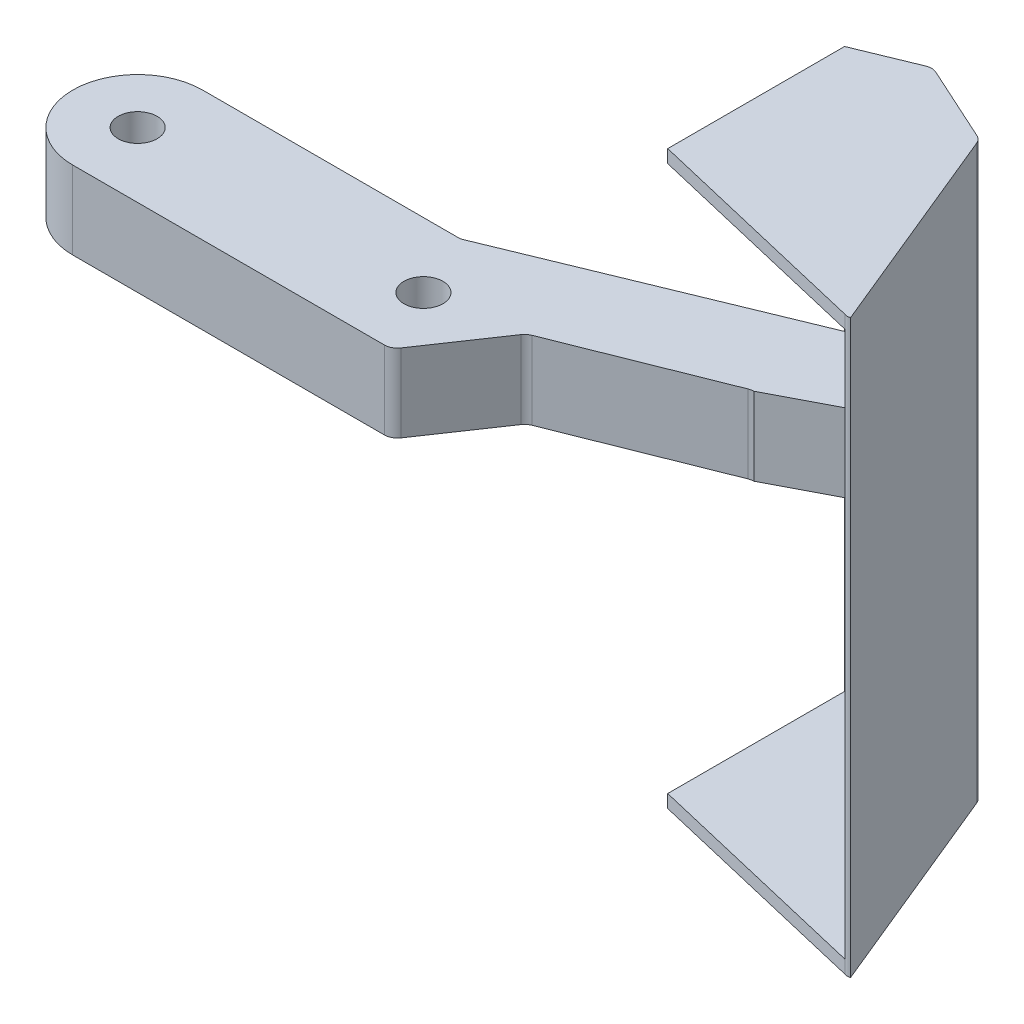
ISO-10303-21;
HEADER;
FILE_DESCRIPTION(('STEP AP214'),'2;1');
FILE_NAME('part.step','',(''),(''),'','','');
FILE_SCHEMA(('AUTOMOTIVE_DESIGN { 1 0 10303 214 1 1 1 1 }'));
ENDSEC;
DATA;
#1=APPLICATION_CONTEXT('core data for automotive mechanical design processes');
#2=APPLICATION_PROTOCOL_DEFINITION('international standard','automotive_design',2000,#1);
#3=PRODUCT_CONTEXT('',#1,'mechanical');
#4=PRODUCT('Part','Part','',(#3));
#5=PRODUCT_RELATED_PRODUCT_CATEGORY('part','',(#4));
#6=PRODUCT_DEFINITION_FORMATION('','',#4);
#7=PRODUCT_DEFINITION_CONTEXT('part definition',#1,'design');
#8=PRODUCT_DEFINITION('design','',#6,#7);
#9=PRODUCT_DEFINITION_SHAPE('','',#8);
#10=(LENGTH_UNIT() NAMED_UNIT(*) SI_UNIT(.MILLI.,.METRE.));
#11=(NAMED_UNIT(*) PLANE_ANGLE_UNIT() SI_UNIT($,.RADIAN.));
#12=(NAMED_UNIT(*) SI_UNIT($,.STERADIAN.) SOLID_ANGLE_UNIT());
#13=UNCERTAINTY_MEASURE_WITH_UNIT(LENGTH_MEASURE(1.E-05),#10,'distance_accuracy_value','');
#14=(GEOMETRIC_REPRESENTATION_CONTEXT(3) GLOBAL_UNCERTAINTY_ASSIGNED_CONTEXT((#13)) GLOBAL_UNIT_ASSIGNED_CONTEXT((#10,
#11,#12)) REPRESENTATION_CONTEXT('',''));
#15=CARTESIAN_POINT('',(0.,0.,0.));
#16=DIRECTION('',(0.,0.,1.));
#17=DIRECTION('',(1.,0.,0.));
#18=AXIS2_PLACEMENT_3D('',#15,#16,#17);
#19=CARTESIAN_POINT('',(29.3927079970185,6.,-0.393076672311641));
#20=DIRECTION('',(0.,-1.,0.));
#21=DIRECTION('',(0.,0.,-1.));
#22=AXIS2_PLACEMENT_3D('',#19,#20,#21);
#23=PLANE('',#22);
#24=CARTESIAN_POINT('',(22.,6.,0.));
#25=DIRECTION('',(0.,1.,0.));
#26=DIRECTION('',(0.,0.,1.));
#27=AXIS2_PLACEMENT_3D('',#24,#25,#26);
#28=CIRCLE('',#27,1.5);
#29=CARTESIAN_POINT('',(22.,6.,1.5));
#30=VERTEX_POINT('',#29);
#31=EDGE_CURVE('E363',#30,#30,#28,.T.);
#32=ORIENTED_EDGE('',*,*,#31,.F.);
#33=EDGE_LOOP('',(#32));
#34=FACE_BOUND('',#33,.T.);
#35=CARTESIAN_POINT('',(0.,6.,0.));
#36=DIRECTION('',(0.,1.,0.));
#37=DIRECTION('',(0.,0.,1.));
#38=AXIS2_PLACEMENT_3D('',#35,#36,#37);
#39=CIRCLE('',#38,1.5);
#40=CARTESIAN_POINT('',(0.,6.,1.5));
#41=VERTEX_POINT('',#40);
#42=EDGE_CURVE('E371',#41,#41,#39,.T.);
#43=ORIENTED_EDGE('',*,*,#42,.F.);
#44=EDGE_LOOP('',(#43));
#45=FACE_BOUND('',#44,.T.);
#46=CARTESIAN_POINT('',(41.2999485405069,6.,-5.14117513021263));
#47=DIRECTION('',(0.,-1.,0.));
#48=DIRECTION('',(0.,0.,-1.));
#49=AXIS2_PLACEMENT_3D('',#46,#47,#48);
#50=CIRCLE('',#49,1.);
#51=CARTESIAN_POINT('',(40.9295532164884,6.,-6.07004934341117));
#52=VERTEX_POINT('',#51);
#53=CARTESIAN_POINT('',(41.3044863809881,6.,-6.14116483416151));
#54=VERTEX_POINT('',#53);
#55=EDGE_CURVE('E387',#52,#54,#50,.T.);
#56=ORIENTED_EDGE('',*,*,#55,.T.);
#57=DIRECTION('',(0.886807807341087,0.,-0.462138413074366));
#58=VECTOR('',#57,1.);
#59=CARTESIAN_POINT('',(29.5810020879882,6.,-0.0317549011190851));
#60=LINE('',#59,#58);
#61=CARTESIAN_POINT('',(50.2217081147766,6.,-10.7881589934047));
#62=VERTEX_POINT('',#61);
#63=EDGE_CURVE('E285',#54,#62,#60,.T.);
#64=ORIENTED_EDGE('',*,*,#63,.T.);
#65=DIRECTION('',(0.957727854261941,0.,0.28767578481829));
#66=VECTOR('',#65,1.);
#67=CARTESIAN_POINT('',(33.9804632704377,6.,-15.66659375567));
#68=LINE('',#67,#66);
#69=CARTESIAN_POINT('',(40.8064668151839,6.,-13.6162451956183));
#70=VERTEX_POINT('',#69);
#71=EDGE_CURVE('E358',#70,#62,#68,.T.);
#72=ORIENTED_EDGE('',*,*,#71,.F.);
#73=DIRECTION('',(-0.924878228166549,0.,0.380263412733207));
#74=VECTOR('',#73,1.);
#75=CARTESIAN_POINT('',(20.0327114807882,6.,-5.07512177183345));
#76=LINE('',#75,#74);
#77=CARTESIAN_POINT('',(20.0327114807882,6.,-5.07512177183345));
#78=VERTEX_POINT('',#77);
#79=EDGE_CURVE('E391',#70,#78,#76,.T.);
#80=ORIENTED_EDGE('',*,*,#79,.T.);
#81=CARTESIAN_POINT('',(19.652448068055,6.,-6.));
#82=DIRECTION('',(0.,-1.,0.));
#83=DIRECTION('',(0.,0.,1.));
#84=AXIS2_PLACEMENT_3D('',#81,#82,#83);
#85=CIRCLE('',#84,1.);
#86=CARTESIAN_POINT('',(19.652448068055,6.,-5.));
#87=VERTEX_POINT('',#86);
#88=EDGE_CURVE('E394',#78,#87,#85,.T.);
#89=ORIENTED_EDGE('',*,*,#88,.T.);
#90=DIRECTION('',(-1.,0.,0.));
#91=VECTOR('',#90,1.);
#92=CARTESIAN_POINT('',(0.,6.,-5.));
#93=LINE('',#92,#91);
#94=CARTESIAN_POINT('',(0.,6.,-5.));
#95=VERTEX_POINT('',#94);
#96=EDGE_CURVE('E397',#87,#95,#93,.T.);
#97=ORIENTED_EDGE('',*,*,#96,.T.);
#98=CARTESIAN_POINT('',(0.,6.,0.));
#99=DIRECTION('',(0.,1.,0.));
#100=DIRECTION('',(0.,0.,1.));
#101=AXIS2_PLACEMENT_3D('',#98,#99,#100);
#102=CIRCLE('',#101,5.);
#103=CARTESIAN_POINT('',(0.,6.,5.));
#104=VERTEX_POINT('',#103);
#105=EDGE_CURVE('E400',#95,#104,#102,.T.);
#106=ORIENTED_EDGE('',*,*,#105,.T.);
#107=DIRECTION('',(1.,0.,0.));
#108=VECTOR('',#107,1.);
#109=CARTESIAN_POINT('',(0.,6.,5.));
#110=LINE('',#109,#108);
#111=CARTESIAN_POINT('',(23.9988758721515,6.,5.));
#112=VERTEX_POINT('',#111);
#113=EDGE_CURVE('E403',#104,#112,#110,.T.);
#114=ORIENTED_EDGE('',*,*,#113,.T.);
#115=CARTESIAN_POINT('',(23.9988758721515,6.,4.));
#116=DIRECTION('',(0.,1.,0.));
#117=DIRECTION('',(0.,0.,1.));
#118=AXIS2_PLACEMENT_3D('',#115,#116,#117);
#119=CIRCLE('',#118,1.);
#120=CARTESIAN_POINT('',(24.8266425433876,6.,4.56107248906957));
#121=VERTEX_POINT('',#120);
#122=EDGE_CURVE('E406',#112,#121,#119,.T.);
#123=ORIENTED_EDGE('',*,*,#122,.T.);
#124=DIRECTION('',(0.561072489069578,0.,-0.827766671236085));
#125=VECTOR('',#124,1.);
#126=CARTESIAN_POINT('',(24.8266425433876,6.,4.56107248906957));
#127=LINE('',#126,#125);
#128=CARTESIAN_POINT('',(28.5649413257824,6.,-0.954149161381216));
#129=VERTEX_POINT('',#128);
#130=EDGE_CURVE('E409',#121,#129,#127,.T.);
#131=ORIENTED_EDGE('',*,*,#130,.T.);
#132=CARTESIAN_POINT('',(29.3927079970185,6.,-0.393076672311641));
#133=DIRECTION('',(0.,-1.,0.));
#134=DIRECTION('',(0.,0.,-1.));
#135=AXIS2_PLACEMENT_3D('',#132,#133,#134);
#136=CIRCLE('',#135,1.);
#137=CARTESIAN_POINT('',(29.022312673,6.,-1.32195088551018));
#138=VERTEX_POINT('',#137);
#139=EDGE_CURVE('E379',#129,#138,#136,.T.);
#140=ORIENTED_EDGE('',*,*,#139,.T.);
#141=DIRECTION('',(0.92887421319854,0.,-0.370395324018532));
#142=VECTOR('',#141,1.);
#143=CARTESIAN_POINT('',(29.022312673,6.,-1.32195088551018));
#144=LINE('',#143,#142);
#145=EDGE_CURVE('E383',#138,#52,#144,.T.);
#146=ORIENTED_EDGE('',*,*,#145,.T.);
#147=EDGE_LOOP('',(#56,#64,#72,#80,#89,#97,#106,#114,#123,#131,#140,#146));
#148=FACE_BOUND('',#147,.T.);
#149=ADVANCED_FACE('F47',(#34,#45,#148),#23,.F.);
#150=CARTESIAN_POINT('',(29.3927079970185,0.,-0.393076672311641));
#151=DIRECTION('',(0.,-1.,0.));
#152=DIRECTION('',(0.,0.,-1.));
#153=AXIS2_PLACEMENT_3D('',#150,#151,#152);
#154=PLANE('',#153);
#155=DIRECTION('',(0.886807807341087,0.,-0.462138413074366));
#156=VECTOR('',#155,1.);
#157=CARTESIAN_POINT('',(41.3044863809881,0.,-6.14116483416151));
#158=LINE('',#157,#156);
#159=CARTESIAN_POINT('',(41.3044863809881,0.,-6.14116483416151));
#160=VERTEX_POINT('',#159);
#161=CARTESIAN_POINT('',(50.2217081147766,0.,-10.7881589934047));
#162=VERTEX_POINT('',#161);
#163=EDGE_CURVE('E276',#160,#162,#158,.T.);
#164=ORIENTED_EDGE('',*,*,#163,.F.);
#165=CARTESIAN_POINT('',(41.2999485405069,0.,-5.14117513021263));
#166=DIRECTION('',(0.,-1.,0.));
#167=DIRECTION('',(0.,0.,-1.));
#168=AXIS2_PLACEMENT_3D('',#165,#166,#167);
#169=CIRCLE('',#168,1.);
#170=CARTESIAN_POINT('',(40.9295532164884,0.,-6.07004934341117));
#171=VERTEX_POINT('',#170);
#172=EDGE_CURVE('E419',#171,#160,#169,.T.);
#173=ORIENTED_EDGE('',*,*,#172,.F.);
#174=DIRECTION('',(0.92887421319854,0.,-0.370395324018532));
#175=VECTOR('',#174,1.);
#176=CARTESIAN_POINT('',(29.022312673,0.,-1.32195088551018));
#177=LINE('',#176,#175);
#178=CARTESIAN_POINT('',(29.022312673,0.,-1.32195088551018));
#179=VERTEX_POINT('',#178);
#180=EDGE_CURVE('E416',#179,#171,#177,.T.);
#181=ORIENTED_EDGE('',*,*,#180,.F.);
#182=CARTESIAN_POINT('',(29.3927079970185,0.,-0.393076672311641));
#183=DIRECTION('',(0.,-1.,0.));
#184=DIRECTION('',(0.,0.,-1.));
#185=AXIS2_PLACEMENT_3D('',#182,#183,#184);
#186=CIRCLE('',#185,1.);
#187=CARTESIAN_POINT('',(28.5649413257824,0.,-0.954149161381216));
#188=VERTEX_POINT('',#187);
#189=EDGE_CURVE('E375',#188,#179,#186,.T.);
#190=ORIENTED_EDGE('',*,*,#189,.F.);
#191=DIRECTION('',(0.561072489069578,0.,-0.827766671236085));
#192=VECTOR('',#191,1.);
#193=CARTESIAN_POINT('',(24.8266425433876,0.,4.56107248906957));
#194=LINE('',#193,#192);
#195=CARTESIAN_POINT('',(24.8266425433876,0.,4.56107248906957));
#196=VERTEX_POINT('',#195);
#197=EDGE_CURVE('E384',#196,#188,#194,.T.);
#198=ORIENTED_EDGE('',*,*,#197,.F.);
#199=CARTESIAN_POINT('',(23.9988758721515,0.,4.));
#200=DIRECTION('',(0.,1.,0.));
#201=DIRECTION('',(0.,0.,1.));
#202=AXIS2_PLACEMENT_3D('',#199,#200,#201);
#203=CIRCLE('',#202,1.);
#204=CARTESIAN_POINT('',(23.9988758721515,0.,5.));
#205=VERTEX_POINT('',#204);
#206=EDGE_CURVE('E438',#205,#196,#203,.T.);
#207=ORIENTED_EDGE('',*,*,#206,.F.);
#208=DIRECTION('',(1.,0.,0.));
#209=VECTOR('',#208,1.);
#210=CARTESIAN_POINT('',(0.,0.,5.));
#211=LINE('',#210,#209);
#212=CARTESIAN_POINT('',(0.,0.,5.));
#213=VERTEX_POINT('',#212);
#214=EDGE_CURVE('E435',#213,#205,#211,.T.);
#215=ORIENTED_EDGE('',*,*,#214,.F.);
#216=CARTESIAN_POINT('',(0.,0.,0.));
#217=DIRECTION('',(0.,1.,0.));
#218=DIRECTION('',(0.,0.,1.));
#219=AXIS2_PLACEMENT_3D('',#216,#217,#218);
#220=CIRCLE('',#219,5.);
#221=CARTESIAN_POINT('',(0.,0.,-5.));
#222=VERTEX_POINT('',#221);
#223=EDGE_CURVE('E432',#222,#213,#220,.T.);
#224=ORIENTED_EDGE('',*,*,#223,.F.);
#225=DIRECTION('',(-1.,0.,0.));
#226=VECTOR('',#225,1.);
#227=CARTESIAN_POINT('',(0.,0.,-5.));
#228=LINE('',#227,#226);
#229=CARTESIAN_POINT('',(19.652448068055,0.,-5.));
#230=VERTEX_POINT('',#229);
#231=EDGE_CURVE('E429',#230,#222,#228,.T.);
#232=ORIENTED_EDGE('',*,*,#231,.F.);
#233=CARTESIAN_POINT('',(19.652448068055,0.,-6.));
#234=DIRECTION('',(0.,-1.,0.));
#235=DIRECTION('',(0.,0.,1.));
#236=AXIS2_PLACEMENT_3D('',#233,#234,#235);
#237=CIRCLE('',#236,1.);
#238=CARTESIAN_POINT('',(20.0327114807882,0.,-5.07512177183345));
#239=VERTEX_POINT('',#238);
#240=EDGE_CURVE('E426',#239,#230,#237,.T.);
#241=ORIENTED_EDGE('',*,*,#240,.F.);
#242=DIRECTION('',(-0.924878228166549,0.,0.380263412733207));
#243=VECTOR('',#242,1.);
#244=CARTESIAN_POINT('',(20.0327114807882,0.,-5.07512177183345));
#245=LINE('',#244,#243);
#246=CARTESIAN_POINT('',(40.8064668151839,0.,-13.6162451956183));
#247=VERTEX_POINT('',#246);
#248=EDGE_CURVE('E423',#247,#239,#245,.T.);
#249=ORIENTED_EDGE('',*,*,#248,.F.);
#250=DIRECTION('',(0.957727854261941,0.,0.28767578481829));
#251=VECTOR('',#250,1.);
#252=CARTESIAN_POINT('',(33.9804632704377,0.,-15.66659375567));
#253=LINE('',#252,#251);
#254=EDGE_CURVE('E354',#247,#162,#253,.T.);
#255=ORIENTED_EDGE('',*,*,#254,.T.);
#256=EDGE_LOOP('',(#164,#173,#181,#190,#198,#207,#215,#224,#232,#241,#249,#255));
#257=FACE_BOUND('',#256,.T.);
#258=CARTESIAN_POINT('',(0.,0.,0.));
#259=DIRECTION('',(0.,1.,0.));
#260=DIRECTION('',(0.,0.,1.));
#261=AXIS2_PLACEMENT_3D('',#258,#259,#260);
#262=CIRCLE('',#261,1.5);
#263=CARTESIAN_POINT('',(0.,0.,1.5));
#264=VERTEX_POINT('',#263);
#265=EDGE_CURVE('E367',#264,#264,#262,.T.);
#266=ORIENTED_EDGE('',*,*,#265,.T.);
#267=EDGE_LOOP('',(#266));
#268=FACE_BOUND('',#267,.T.);
#269=CARTESIAN_POINT('',(22.,0.,0.));
#270=DIRECTION('',(0.,1.,0.));
#271=DIRECTION('',(0.,0.,1.));
#272=AXIS2_PLACEMENT_3D('',#269,#270,#271);
#273=CIRCLE('',#272,1.5);
#274=CARTESIAN_POINT('',(22.,0.,1.5));
#275=VERTEX_POINT('',#274);
#276=EDGE_CURVE('E362',#275,#275,#273,.T.);
#277=ORIENTED_EDGE('',*,*,#276,.T.);
#278=EDGE_LOOP('',(#277));
#279=FACE_BOUND('',#278,.T.);
#280=ADVANCED_FACE('F492',(#257,#268,#279),#154,.T.);
#281=CARTESIAN_POINT('',(29.3927079970185,6.,-0.393076672311641));
#282=DIRECTION('',(0.,-1.,0.));
#283=DIRECTION('',(0.,0.,-1.));
#284=AXIS2_PLACEMENT_3D('',#281,#282,#283);
#285=CYLINDRICAL_SURFACE('',#284,1.);
#286=ORIENTED_EDGE('',*,*,#189,.T.);
#287=DIRECTION('',(0.,-1.,0.));
#288=VECTOR('',#287,1.);
#289=CARTESIAN_POINT('',(29.022312673,6.,-1.32195088551018));
#290=LINE('',#289,#288);
#291=EDGE_CURVE('E11',#138,#179,#290,.T.);
#292=ORIENTED_EDGE('',*,*,#291,.F.);
#293=ORIENTED_EDGE('',*,*,#139,.F.);
#294=DIRECTION('',(0.,-1.,0.));
#295=VECTOR('',#294,1.);
#296=CARTESIAN_POINT('',(28.5649413257824,6.,-0.954149161381216));
#297=LINE('',#296,#295);
#298=EDGE_CURVE('E412',#129,#188,#297,.T.);
#299=ORIENTED_EDGE('',*,*,#298,.T.);
#300=EDGE_LOOP('',(#286,#292,#293,#299));
#301=FACE_BOUND('',#300,.T.);
#302=ADVANCED_FACE('F49',(#301),#285,.F.);
#303=CARTESIAN_POINT('',(29.022312673,6.,-1.32195088551018));
#304=DIRECTION('',(-0.370395324018532,0.,-0.92887421319854));
#305=DIRECTION('',(-0.92887421319854,0.,0.370395324018532));
#306=AXIS2_PLACEMENT_3D('',#303,#304,#305);
#307=PLANE('',#306);
#308=ORIENTED_EDGE('',*,*,#180,.T.);
#309=DIRECTION('',(0.,-1.,0.));
#310=VECTOR('',#309,1.);
#311=CARTESIAN_POINT('',(40.9295532164884,6.,-6.07004934341117));
#312=LINE('',#311,#310);
#313=EDGE_CURVE('E56',#52,#171,#312,.T.);
#314=ORIENTED_EDGE('',*,*,#313,.F.);
#315=ORIENTED_EDGE('',*,*,#145,.F.);
#316=ORIENTED_EDGE('',*,*,#291,.T.);
#317=EDGE_LOOP('',(#308,#314,#315,#316));
#318=FACE_BOUND('',#317,.T.);
#319=ADVANCED_FACE('F527',(#318),#307,.F.);
#320=CARTESIAN_POINT('',(41.2999485405069,6.,-5.14117513021263));
#321=DIRECTION('',(0.,-1.,0.));
#322=DIRECTION('',(0.,0.,-1.));
#323=AXIS2_PLACEMENT_3D('',#320,#321,#322);
#324=CYLINDRICAL_SURFACE('',#323,1.);
#325=ORIENTED_EDGE('',*,*,#172,.T.);
#326=DIRECTION('',(0.,-1.,0.));
#327=VECTOR('',#326,1.);
#328=CARTESIAN_POINT('',(41.3044863809881,25.,-6.14116483416151));
#329=LINE('',#328,#327);
#330=EDGE_CURVE('E280',#54,#160,#329,.T.);
#331=ORIENTED_EDGE('',*,*,#330,.F.);
#332=ORIENTED_EDGE('',*,*,#55,.F.);
#333=ORIENTED_EDGE('',*,*,#313,.T.);
#334=EDGE_LOOP('',(#325,#331,#332,#333));
#335=FACE_BOUND('',#334,.T.);
#336=ADVANCED_FACE('F487',(#335),#324,.F.);
#337=CARTESIAN_POINT('',(52.341745918113,6.,-12.2448345027485));
#338=DIRECTION('',(-0.92487822816655,0.,0.380263412733204));
#339=DIRECTION('',(0.380263412733204,0.,0.92487822816655));
#340=AXIS2_PLACEMENT_3D('',#337,#338,#339);
#341=PLANE('',#340);
#342=DIRECTION('',(0.,-1.,0.));
#343=VECTOR('',#342,1.);
#344=CARTESIAN_POINT('',(52.341745918113,6.,-12.2448345027485));
#345=LINE('',#344,#343);
#346=CARTESIAN_POINT('',(52.341745918113,25.,-12.2448345027485));
#347=VERTEX_POINT('',#346);
#348=CARTESIAN_POINT('',(52.341745918113,-19.,-12.2448345027485));
#349=VERTEX_POINT('',#348);
#350=EDGE_CURVE('E479',#347,#349,#345,.T.);
#351=ORIENTED_EDGE('',*,*,#350,.F.);
#352=DIRECTION('',(0.380263412733212,0.,0.924878228166547));
#353=VECTOR('',#352,1.);
#354=CARTESIAN_POINT('',(49.0795915521628,25.,-20.1790596975939));
#355=LINE('',#354,#353);
#356=CARTESIAN_POINT('',(59.1147618685715,25.,4.22852260141965));
#357=VERTEX_POINT('',#356);
#358=EDGE_CURVE('E307',#347,#357,#355,.T.);
#359=ORIENTED_EDGE('',*,*,#358,.T.);
#360=DIRECTION('',(0.,1.,0.));
#361=VECTOR('',#360,1.);
#362=CARTESIAN_POINT('',(59.1147618685715,-19.,4.22852260141965));
#363=LINE('',#362,#361);
#364=CARTESIAN_POINT('',(59.1147618685715,-19.,4.22852260141965));
#365=VERTEX_POINT('',#364);
#366=EDGE_CURVE('E341',#365,#357,#363,.T.);
#367=ORIENTED_EDGE('',*,*,#366,.F.);
#368=DIRECTION('',(0.380263412733212,0.,0.924878228166547));
#369=VECTOR('',#368,1.);
#370=CARTESIAN_POINT('',(49.0795915521628,-19.,-20.1790596975939));
#371=LINE('',#370,#369);
#372=EDGE_CURVE('E330',#349,#365,#371,.T.);
#373=ORIENTED_EDGE('',*,*,#372,.F.);
#374=EDGE_LOOP('',(#351,#359,#367,#373));
#375=FACE_BOUND('',#374,.T.);
#376=ADVANCED_FACE('F576',(#375),#341,.F.);
#377=CARTESIAN_POINT('',(51.4168676899464,6.,-11.8645710900153));
#378=DIRECTION('',(0.,-1.,0.));
#379=DIRECTION('',(0.,0.,-1.));
#380=AXIS2_PLACEMENT_3D('',#377,#378,#379);
#381=CYLINDRICAL_SURFACE('',#380,1.);
#382=ORIENTED_EDGE('',*,*,#350,.T.);
#383=CARTESIAN_POINT('',(51.4168676899464,-19.,-11.8645710900153));
#384=DIRECTION('',(0.,-1.,0.));
#385=DIRECTION('',(0.,0.,-1.));
#386=AXIS2_PLACEMENT_3D('',#383,#384,#385);
#387=CIRCLE('',#386,1.);
#388=CARTESIAN_POINT('',(51.8314021080849,-19.,-12.7746047246566));
#389=VERTEX_POINT('',#388);
#390=EDGE_CURVE('E326',#389,#349,#387,.T.);
#391=ORIENTED_EDGE('',*,*,#390,.F.);
#392=DIRECTION('',(0.,-1.,0.));
#393=VECTOR('',#392,1.);
#394=CARTESIAN_POINT('',(51.8314021080849,6.,-12.7746047246566));
#395=LINE('',#394,#393);
#396=CARTESIAN_POINT('',(51.8314021080849,25.,-12.7746047246566));
#397=VERTEX_POINT('',#396);
#398=EDGE_CURVE('E476',#397,#389,#395,.T.);
#399=ORIENTED_EDGE('',*,*,#398,.F.);
#400=CARTESIAN_POINT('',(51.4168676899464,25.,-11.8645710900153));
#401=DIRECTION('',(0.,-1.,0.));
#402=DIRECTION('',(0.,0.,-1.));
#403=AXIS2_PLACEMENT_3D('',#400,#401,#402);
#404=CIRCLE('',#403,1.);
#405=EDGE_CURVE('E303',#397,#347,#404,.T.);
#406=ORIENTED_EDGE('',*,*,#405,.T.);
#407=EDGE_LOOP('',(#382,#391,#399,#406));
#408=FACE_BOUND('',#407,.T.);
#409=ADVANCED_FACE('F579',(#408),#381,.T.);
#410=CARTESIAN_POINT('',(46.0241839243038,6.,-15.4198825684427));
#411=DIRECTION('',(-0.414534418138482,0.,0.910033634641374));
#412=DIRECTION('',(0.910033634641374,0.,0.414534418138482));
#413=AXIS2_PLACEMENT_3D('',#410,#411,#412);
#414=PLANE('',#413);
#415=ORIENTED_EDGE('',*,*,#398,.T.);
#416=DIRECTION('',(0.910033634641374,0.,0.414534418138482));
#417=VECTOR('',#416,1.);
#418=CARTESIAN_POINT('',(13.7257403509048,-19.,-30.1323239594181));
#419=LINE('',#418,#417);
#420=CARTESIAN_POINT('',(46.0241839243038,-19.,-15.4198825684427));
#421=VERTEX_POINT('',#420);
#422=EDGE_CURVE('E322',#421,#389,#419,.T.);
#423=ORIENTED_EDGE('',*,*,#422,.F.);
#424=DIRECTION('',(0.,-1.,0.));
#425=VECTOR('',#424,1.);
#426=CARTESIAN_POINT('',(46.0241839243038,6.,-15.4198825684427));
#427=LINE('',#426,#425);
#428=CARTESIAN_POINT('',(46.0241839243038,25.,-15.4198825684427));
#429=VERTEX_POINT('',#428);
#430=EDGE_CURVE('E473',#429,#421,#427,.T.);
#431=ORIENTED_EDGE('',*,*,#430,.F.);
#432=DIRECTION('',(0.910033634641374,0.,0.414534418138482));
#433=VECTOR('',#432,1.);
#434=CARTESIAN_POINT('',(13.7257403509048,25.,-30.1323239594181));
#435=LINE('',#434,#433);
#436=EDGE_CURVE('E299',#429,#397,#435,.T.);
#437=ORIENTED_EDGE('',*,*,#436,.T.);
#438=EDGE_LOOP('',(#415,#423,#431,#437));
#439=FACE_BOUND('',#438,.T.);
#440=ADVANCED_FACE('F583',(#439),#414,.F.);
#441=CARTESIAN_POINT('',(45.6096495061653,6.,-14.5098489338013));
#442=DIRECTION('',(0.,-1.,0.));
#443=DIRECTION('',(0.,0.,-1.));
#444=AXIS2_PLACEMENT_3D('',#441,#442,#443);
#445=CYLINDRICAL_SURFACE('',#444,1.);
#446=ORIENTED_EDGE('',*,*,#430,.T.);
#447=CARTESIAN_POINT('',(45.6096495061653,-19.,-14.5098489338013));
#448=DIRECTION('',(0.,-1.,0.));
#449=DIRECTION('',(0.,0.,-1.));
#450=AXIS2_PLACEMENT_3D('',#447,#448,#449);
#451=CIRCLE('',#450,1.);
#452=CARTESIAN_POINT('',(45.2293860934321,-19.,-15.4347271619678));
#453=VERTEX_POINT('',#452);
#454=EDGE_CURVE('E318',#453,#421,#451,.T.);
#455=ORIENTED_EDGE('',*,*,#454,.F.);
#456=DIRECTION('',(0.,-1.,0.));
#457=VECTOR('',#456,1.);
#458=CARTESIAN_POINT('',(45.2293860934321,6.,-15.4347271619678));
#459=LINE('',#458,#457);
#460=CARTESIAN_POINT('',(45.2293860934321,25.,-15.4347271619678));
#461=VERTEX_POINT('',#460);
#462=EDGE_CURVE('E470',#461,#453,#459,.T.);
#463=ORIENTED_EDGE('',*,*,#462,.F.);
#464=CARTESIAN_POINT('',(45.6096495061653,25.,-14.5098489338013));
#465=DIRECTION('',(0.,-1.,0.));
#466=DIRECTION('',(0.,0.,-1.));
#467=AXIS2_PLACEMENT_3D('',#464,#465,#466);
#468=CIRCLE('',#467,1.);
#469=EDGE_CURVE('E295',#461,#429,#468,.T.);
#470=ORIENTED_EDGE('',*,*,#469,.T.);
#471=EDGE_LOOP('',(#446,#455,#463,#470));
#472=FACE_BOUND('',#471,.T.);
#473=ADVANCED_FACE('F586',(#472),#445,.T.);
#474=CARTESIAN_POINT('',(20.0327114807882,6.,-5.07512177183345));
#475=DIRECTION('',(0.380263412733207,0.,0.924878228166549));
#476=DIRECTION('',(0.924878228166549,0.,-0.380263412733207));
#477=AXIS2_PLACEMENT_3D('',#474,#475,#476);
#478=PLANE('',#477);
#479=ORIENTED_EDGE('',*,*,#462,.T.);
#480=DIRECTION('',(0.924878228166549,0.,-0.380263412733207));
#481=VECTOR('',#480,1.);
#482=CARTESIAN_POINT('',(1.11182846478431,-19.,2.7041937407118));
#483=LINE('',#482,#481);
#484=CARTESIAN_POINT('',(40.8064668151839,-19.,-13.6162451956183));
#485=VERTEX_POINT('',#484);
#486=EDGE_CURVE('E314',#485,#453,#483,.T.);
#487=ORIENTED_EDGE('',*,*,#486,.F.);
#488=DIRECTION('',(0.,1.,0.));
#489=VECTOR('',#488,1.);
#490=CARTESIAN_POINT('',(40.8064668151839,-19.,-13.6162451956183));
#491=LINE('',#490,#489);
#492=CARTESIAN_POINT('',(40.8064668151839,-18.,-13.6162451956183));
#493=VERTEX_POINT('',#492);
#494=EDGE_CURVE('E345',#485,#493,#491,.T.);
#495=ORIENTED_EDGE('',*,*,#494,.T.);
#496=EDGE_CURVE('E350',#493,#247,#491,.T.);
#497=ORIENTED_EDGE('',*,*,#496,.T.);
#498=ORIENTED_EDGE('',*,*,#248,.T.);
#499=DIRECTION('',(0.,-1.,0.));
#500=VECTOR('',#499,1.);
#501=CARTESIAN_POINT('',(20.0327114807882,6.,-5.07512177183345));
#502=LINE('',#501,#500);
#503=EDGE_CURVE('E466',#78,#239,#502,.T.);
#504=ORIENTED_EDGE('',*,*,#503,.F.);
#505=ORIENTED_EDGE('',*,*,#79,.F.);
#506=CARTESIAN_POINT('',(40.8064668151839,24.,-13.6162451956183));
#507=VERTEX_POINT('',#506);
#508=EDGE_CURVE('E344',#70,#507,#491,.T.);
#509=ORIENTED_EDGE('',*,*,#508,.T.);
#510=DIRECTION('',(0.,1.,0.));
#511=VECTOR('',#510,1.);
#512=CARTESIAN_POINT('',(40.8064668151839,24.,-13.6162451956183));
#513=LINE('',#512,#511);
#514=CARTESIAN_POINT('',(40.8064668151839,25.,-13.6162451956183));
#515=VERTEX_POINT('',#514);
#516=EDGE_CURVE('E224',#507,#515,#513,.T.);
#517=ORIENTED_EDGE('',*,*,#516,.T.);
#518=DIRECTION('',(0.924878228166549,0.,-0.380263412733207));
#519=VECTOR('',#518,1.);
#520=CARTESIAN_POINT('',(1.11182846478431,25.,2.7041937407118));
#521=LINE('',#520,#519);
#522=EDGE_CURVE('E291',#515,#461,#521,.T.);
#523=ORIENTED_EDGE('',*,*,#522,.T.);
#524=EDGE_LOOP('',(#479,#487,#495,#497,#498,#504,#505,#509,#517,#523));
#525=FACE_BOUND('',#524,.T.);
#526=ADVANCED_FACE('F518',(#525),#478,.F.);
#527=CARTESIAN_POINT('',(19.652448068055,6.,-6.));
#528=DIRECTION('',(0.,-1.,0.));
#529=DIRECTION('',(0.,0.,-1.));
#530=AXIS2_PLACEMENT_3D('',#527,#528,#529);
#531=CYLINDRICAL_SURFACE('',#530,1.);
#532=ORIENTED_EDGE('',*,*,#240,.T.);
#533=DIRECTION('',(0.,-1.,0.));
#534=VECTOR('',#533,1.);
#535=CARTESIAN_POINT('',(19.652448068055,6.,-5.));
#536=LINE('',#535,#534);
#537=EDGE_CURVE('E462',#87,#230,#536,.T.);
#538=ORIENTED_EDGE('',*,*,#537,.F.);
#539=ORIENTED_EDGE('',*,*,#88,.F.);
#540=ORIENTED_EDGE('',*,*,#503,.T.);
#541=EDGE_LOOP('',(#532,#538,#539,#540));
#542=FACE_BOUND('',#541,.T.);
#543=ADVANCED_FACE('F558',(#542),#531,.F.);
#544=CARTESIAN_POINT('',(0.,6.,-5.));
#545=DIRECTION('',(0.,0.,1.));
#546=DIRECTION('',(1.,0.,0.));
#547=AXIS2_PLACEMENT_3D('',#544,#545,#546);
#548=PLANE('',#547);
#549=ORIENTED_EDGE('',*,*,#231,.T.);
#550=DIRECTION('',(0.,-1.,0.));
#551=VECTOR('',#550,1.);
#552=CARTESIAN_POINT('',(0.,6.,-5.));
#553=LINE('',#552,#551);
#554=EDGE_CURVE('E458',#95,#222,#553,.T.);
#555=ORIENTED_EDGE('',*,*,#554,.F.);
#556=ORIENTED_EDGE('',*,*,#96,.F.);
#557=ORIENTED_EDGE('',*,*,#537,.T.);
#558=EDGE_LOOP('',(#549,#555,#556,#557));
#559=FACE_BOUND('',#558,.T.);
#560=ADVANCED_FACE('F554',(#559),#548,.F.);
#561=CARTESIAN_POINT('',(0.,6.,0.));
#562=DIRECTION('',(0.,-1.,0.));
#563=DIRECTION('',(0.,0.,-1.));
#564=AXIS2_PLACEMENT_3D('',#561,#562,#563);
#565=CYLINDRICAL_SURFACE('',#564,5.);
#566=ORIENTED_EDGE('',*,*,#223,.T.);
#567=DIRECTION('',(0.,-1.,0.));
#568=VECTOR('',#567,1.);
#569=CARTESIAN_POINT('',(0.,6.,5.));
#570=LINE('',#569,#568);
#571=EDGE_CURVE('E454',#104,#213,#570,.T.);
#572=ORIENTED_EDGE('',*,*,#571,.F.);
#573=ORIENTED_EDGE('',*,*,#105,.F.);
#574=ORIENTED_EDGE('',*,*,#554,.T.);
#575=EDGE_LOOP('',(#566,#572,#573,#574));
#576=FACE_BOUND('',#575,.T.);
#577=ADVANCED_FACE('F549',(#576),#565,.T.);
#578=CARTESIAN_POINT('',(0.,6.,5.));
#579=DIRECTION('',(0.,0.,-1.));
#580=DIRECTION('',(-1.,0.,0.));
#581=AXIS2_PLACEMENT_3D('',#578,#579,#580);
#582=PLANE('',#581);
#583=ORIENTED_EDGE('',*,*,#214,.T.);
#584=DIRECTION('',(0.,-1.,0.));
#585=VECTOR('',#584,1.);
#586=CARTESIAN_POINT('',(23.9988758721515,6.,5.));
#587=LINE('',#586,#585);
#588=EDGE_CURVE('E450',#112,#205,#587,.T.);
#589=ORIENTED_EDGE('',*,*,#588,.F.);
#590=ORIENTED_EDGE('',*,*,#113,.F.);
#591=ORIENTED_EDGE('',*,*,#571,.T.);
#592=EDGE_LOOP('',(#583,#589,#590,#591));
#593=FACE_BOUND('',#592,.T.);
#594=ADVANCED_FACE('F543',(#593),#582,.F.);
#595=CARTESIAN_POINT('',(23.9988758721515,6.,4.));
#596=DIRECTION('',(0.,-1.,0.));
#597=DIRECTION('',(0.,0.,-1.));
#598=AXIS2_PLACEMENT_3D('',#595,#596,#597);
#599=CYLINDRICAL_SURFACE('',#598,1.);
#600=ORIENTED_EDGE('',*,*,#206,.T.);
#601=DIRECTION('',(0.,-1.,0.));
#602=VECTOR('',#601,1.);
#603=CARTESIAN_POINT('',(24.8266425433876,6.,4.56107248906957));
#604=LINE('',#603,#602);
#605=EDGE_CURVE('E446',#121,#196,#604,.T.);
#606=ORIENTED_EDGE('',*,*,#605,.F.);
#607=ORIENTED_EDGE('',*,*,#122,.F.);
#608=ORIENTED_EDGE('',*,*,#588,.T.);
#609=EDGE_LOOP('',(#600,#606,#607,#608));
#610=FACE_BOUND('',#609,.T.);
#611=ADVANCED_FACE('F539',(#610),#599,.T.);
#612=CARTESIAN_POINT('',(24.8266425433876,6.,4.56107248906957));
#613=DIRECTION('',(-0.827766671236085,0.,-0.561072489069578));
#614=DIRECTION('',(-0.561072489069578,0.,0.827766671236085));
#615=AXIS2_PLACEMENT_3D('',#612,#613,#614);
#616=PLANE('',#615);
#617=ORIENTED_EDGE('',*,*,#197,.T.);
#618=ORIENTED_EDGE('',*,*,#298,.F.);
#619=ORIENTED_EDGE('',*,*,#130,.F.);
#620=ORIENTED_EDGE('',*,*,#605,.T.);
#621=EDGE_LOOP('',(#617,#618,#619,#620));
#622=FACE_BOUND('',#621,.T.);
#623=ADVANCED_FACE('F534',(#622),#616,.F.);
#624=CARTESIAN_POINT('',(0.,6.,0.));
#625=DIRECTION('',(0.,-1.,0.));
#626=DIRECTION('',(0.,0.,-1.));
#627=AXIS2_PLACEMENT_3D('',#624,#625,#626);
#628=CYLINDRICAL_SURFACE('',#627,1.5);
#629=ORIENTED_EDGE('',*,*,#42,.T.);
#630=EDGE_LOOP('',(#629));
#631=FACE_BOUND('',#630,.T.);
#632=ORIENTED_EDGE('',*,*,#265,.F.);
#633=EDGE_LOOP('',(#632));
#634=FACE_BOUND('',#633,.T.);
#635=ADVANCED_FACE('F605',(#631,#634),#628,.F.);
#636=CARTESIAN_POINT('',(22.,6.,0.));
#637=DIRECTION('',(0.,-1.,0.));
#638=DIRECTION('',(0.,0.,-1.));
#639=AXIS2_PLACEMENT_3D('',#636,#637,#638);
#640=CYLINDRICAL_SURFACE('',#639,1.5);
#641=ORIENTED_EDGE('',*,*,#31,.T.);
#642=EDGE_LOOP('',(#641));
#643=FACE_BOUND('',#642,.T.);
#644=ORIENTED_EDGE('',*,*,#276,.F.);
#645=EDGE_LOOP('',(#644));
#646=FACE_BOUND('',#645,.T.);
#647=ADVANCED_FACE('F658',(#643,#646),#640,.F.);
#648=CARTESIAN_POINT('',(42.6992067054328,-19.,-24.1104075616895));
#649=DIRECTION('',(0.870771777576706,0.,-0.491687412260985));
#650=DIRECTION('',(-0.491687412260985,0.,-0.870771777576706));
#651=AXIS2_PLACEMENT_3D('',#648,#649,#650);
#652=PLANE('',#651);
#653=DIRECTION('',(0.,1.,0.));
#654=VECTOR('',#653,1.);
#655=CARTESIAN_POINT('',(58.7009830571204,-19.,4.22852260141965));
#656=LINE('',#655,#654);
#657=CARTESIAN_POINT('',(58.7009830571204,-18.,4.22852260141965));
#658=VERTEX_POINT('',#657);
#659=CARTESIAN_POINT('',(58.7009830571204,24.,4.22852260141965));
#660=VERTEX_POINT('',#659);
#661=EDGE_CURVE('E337',#658,#660,#656,.T.);
#662=ORIENTED_EDGE('',*,*,#661,.T.);
#663=DIRECTION('',(-0.491687412260985,0.,-0.870771777576706));
#664=VECTOR('',#663,1.);
#665=CARTESIAN_POINT('',(50.2217081147766,24.,-10.7881589934047));
#666=LINE('',#665,#664);
#667=CARTESIAN_POINT('',(50.2217081147766,24.,-10.7881589934047));
#668=VERTEX_POINT('',#667);
#669=EDGE_CURVE('E63',#660,#668,#666,.T.);
#670=ORIENTED_EDGE('',*,*,#669,.T.);
#671=DIRECTION('',(0.,1.,0.));
#672=VECTOR('',#671,1.);
#673=CARTESIAN_POINT('',(50.2217081147766,-19.,-10.7881589934047));
#674=LINE('',#673,#672);
#675=EDGE_CURVE('E349',#62,#668,#674,.T.);
#676=ORIENTED_EDGE('',*,*,#675,.F.);
#677=DIRECTION('',(0.,-1.,0.));
#678=VECTOR('',#677,1.);
#679=CARTESIAN_POINT('',(50.2217081147766,25.,-10.7881589934047));
#680=LINE('',#679,#678);
#681=EDGE_CURVE('E281',#62,#162,#680,.T.);
#682=ORIENTED_EDGE('',*,*,#681,.T.);
#683=CARTESIAN_POINT('',(50.2217081147766,-18.,-10.7881589934047));
#684=VERTEX_POINT('',#683);
#685=EDGE_CURVE('E351',#684,#162,#674,.T.);
#686=ORIENTED_EDGE('',*,*,#685,.F.);
#687=DIRECTION('',(0.491687412260985,0.,0.870771777576706));
#688=VECTOR('',#687,1.);
#689=CARTESIAN_POINT('',(58.7009830571204,-18.,4.22852260141965));
#690=LINE('',#689,#688);
#691=EDGE_CURVE('E254',#684,#658,#690,.T.);
#692=ORIENTED_EDGE('',*,*,#691,.T.);
#693=EDGE_LOOP('',(#662,#670,#676,#682,#686,#692));
#694=FACE_BOUND('',#693,.T.);
#695=ADVANCED_FACE('F500',(#694),#652,.F.);
#696=CARTESIAN_POINT('',(7.12851667078863,-19.,-23.7321990083289));
#697=DIRECTION('',(0.28767578481829,0.,-0.957727854261941));
#698=DIRECTION('',(-0.957727854261941,0.,-0.28767578481829));
#699=AXIS2_PLACEMENT_3D('',#696,#697,#698);
#700=PLANE('',#699);
#701=ORIENTED_EDGE('',*,*,#675,.T.);
#702=DIRECTION('',(-0.957727854261941,0.,-0.287675784818289));
#703=VECTOR('',#702,1.);
#704=CARTESIAN_POINT('',(40.8064668151839,24.,-13.6162451956183));
#705=LINE('',#704,#703);
#706=EDGE_CURVE('E70',#668,#507,#705,.T.);
#707=ORIENTED_EDGE('',*,*,#706,.T.);
#708=ORIENTED_EDGE('',*,*,#508,.F.);
#709=ORIENTED_EDGE('',*,*,#71,.T.);
#710=EDGE_LOOP('',(#701,#707,#708,#709));
#711=FACE_BOUND('',#710,.T.);
#712=ADVANCED_FACE('F523',(#711),#700,.F.);
#713=ORIENTED_EDGE('',*,*,#496,.F.);
#714=DIRECTION('',(0.957727854261941,0.,0.287675784818289));
#715=VECTOR('',#714,1.);
#716=CARTESIAN_POINT('',(50.2217081147766,-18.,-10.7881589934047));
#717=LINE('',#716,#715);
#718=EDGE_CURVE('E250',#493,#684,#717,.T.);
#719=ORIENTED_EDGE('',*,*,#718,.T.);
#720=ORIENTED_EDGE('',*,*,#685,.T.);
#721=ORIENTED_EDGE('',*,*,#254,.F.);
#722=EDGE_LOOP('',(#713,#719,#720,#721));
#723=FACE_BOUND('',#722,.T.);
#724=ADVANCED_FACE('F561',(#723),#700,.F.);
#725=CARTESIAN_POINT('',(58.907872462846,-19.,3.72532534239716));
#726=DIRECTION('',(0.,1.,0.));
#727=DIRECTION('',(0.,0.,1.));
#728=AXIS2_PLACEMENT_3D('',#725,#726,#727);
#729=CYLINDRICAL_SURFACE('',#728,0.544068660822531);
#730=ORIENTED_EDGE('',*,*,#366,.T.);
#731=CARTESIAN_POINT('',(58.907872462846,25.,3.72532534239716));
#732=DIRECTION('',(0.,-1.,0.));
#733=DIRECTION('',(0.,0.,-1.));
#734=AXIS2_PLACEMENT_3D('',#731,#732,#733);
#735=CIRCLE('',#734,0.544068660822531);
#736=CARTESIAN_POINT('',(58.7009830571204,25.,4.22852260141965));
#737=VERTEX_POINT('',#736);
#738=EDGE_CURVE('E311',#357,#737,#735,.T.);
#739=ORIENTED_EDGE('',*,*,#738,.T.);
#740=DIRECTION('',(0.,1.,0.));
#741=VECTOR('',#740,1.);
#742=CARTESIAN_POINT('',(58.7009830571204,24.,4.22852260141965));
#743=LINE('',#742,#741);
#744=EDGE_CURVE('E236',#660,#737,#743,.T.);
#745=ORIENTED_EDGE('',*,*,#744,.F.);
#746=ORIENTED_EDGE('',*,*,#661,.F.);
#747=CARTESIAN_POINT('',(58.7009830571204,-19.,4.22852260141965));
#748=VERTEX_POINT('',#747);
#749=EDGE_CURVE('E338',#748,#658,#656,.T.);
#750=ORIENTED_EDGE('',*,*,#749,.F.);
#751=CARTESIAN_POINT('',(58.907872462846,-19.,3.72532534239716));
#752=DIRECTION('',(0.,-1.,0.));
#753=DIRECTION('',(0.,0.,-1.));
#754=AXIS2_PLACEMENT_3D('',#751,#752,#753);
#755=CIRCLE('',#754,0.544068660822531);
#756=EDGE_CURVE('E333',#365,#748,#755,.T.);
#757=ORIENTED_EDGE('',*,*,#756,.F.);
#758=EDGE_LOOP('',(#730,#739,#745,#746,#750,#757));
#759=FACE_BOUND('',#758,.T.);
#760=ADVANCED_FACE('F508',(#759),#729,.T.);
#761=CARTESIAN_POINT('',(0.,-19.,0.));
#762=DIRECTION('',(0.,-1.,0.));
#763=DIRECTION('',(0.,0.,-1.));
#764=AXIS2_PLACEMENT_3D('',#761,#762,#763);
#765=PLANE('',#764);
#766=DIRECTION('',(0.,0.,-1.));
#767=VECTOR('',#766,1.);
#768=CARTESIAN_POINT('',(40.8064668151839,-19.,-13.6162451956183));
#769=LINE('',#768,#767);
#770=CARTESIAN_POINT('',(40.8064668151839,-19.,0.));
#771=VERTEX_POINT('',#770);
#772=EDGE_CURVE('E255',#771,#485,#769,.T.);
#773=ORIENTED_EDGE('',*,*,#772,.T.);
#774=ORIENTED_EDGE('',*,*,#486,.T.);
#775=ORIENTED_EDGE('',*,*,#454,.T.);
#776=ORIENTED_EDGE('',*,*,#422,.T.);
#777=ORIENTED_EDGE('',*,*,#390,.T.);
#778=ORIENTED_EDGE('',*,*,#372,.T.);
#779=ORIENTED_EDGE('',*,*,#756,.T.);
#780=DIRECTION('',(-0.973197885396587,0.,-0.229969293297193));
#781=VECTOR('',#780,1.);
#782=CARTESIAN_POINT('',(40.8064668151839,-19.,0.));
#783=LINE('',#782,#781);
#784=EDGE_CURVE('E223',#748,#771,#783,.T.);
#785=ORIENTED_EDGE('',*,*,#784,.T.);
#786=EDGE_LOOP('',(#773,#774,#775,#776,#777,#778,#779,#785));
#787=FACE_BOUND('',#786,.T.);
#788=ADVANCED_FACE('F572',(#787),#765,.T.);
#789=CARTESIAN_POINT('',(0.,25.,0.));
#790=DIRECTION('',(0.,-1.,0.));
#791=DIRECTION('',(0.,0.,-1.));
#792=AXIS2_PLACEMENT_3D('',#789,#790,#791);
#793=PLANE('',#792);
#794=ORIENTED_EDGE('',*,*,#522,.F.);
#795=DIRECTION('',(0.,0.,1.));
#796=VECTOR('',#795,1.);
#797=CARTESIAN_POINT('',(40.8064668151839,25.,0.));
#798=LINE('',#797,#796);
#799=CARTESIAN_POINT('',(40.8064668151839,25.,0.));
#800=VERTEX_POINT('',#799);
#801=EDGE_CURVE('E231',#515,#800,#798,.T.);
#802=ORIENTED_EDGE('',*,*,#801,.T.);
#803=DIRECTION('',(0.973197885396587,0.,0.229969293297193));
#804=VECTOR('',#803,1.);
#805=CARTESIAN_POINT('',(58.7009830571204,25.,4.22852260141965));
#806=LINE('',#805,#804);
#807=EDGE_CURVE('E217',#800,#737,#806,.T.);
#808=ORIENTED_EDGE('',*,*,#807,.T.);
#809=ORIENTED_EDGE('',*,*,#738,.F.);
#810=ORIENTED_EDGE('',*,*,#358,.F.);
#811=ORIENTED_EDGE('',*,*,#405,.F.);
#812=ORIENTED_EDGE('',*,*,#436,.F.);
#813=ORIENTED_EDGE('',*,*,#469,.F.);
#814=EDGE_LOOP('',(#794,#802,#808,#809,#810,#811,#812,#813));
#815=FACE_BOUND('',#814,.T.);
#816=ADVANCED_FACE('F513',(#815),#793,.F.);
#817=CARTESIAN_POINT('',(41.3044863809881,25.,-6.14116483416151));
#818=DIRECTION('',(-0.462138413074366,0.,-0.886807807341087));
#819=DIRECTION('',(-0.886807807341087,0.,0.462138413074366));
#820=AXIS2_PLACEMENT_3D('',#817,#818,#819);
#821=PLANE('',#820);
#822=ORIENTED_EDGE('',*,*,#330,.T.);
#823=ORIENTED_EDGE('',*,*,#163,.T.);
#824=ORIENTED_EDGE('',*,*,#681,.F.);
#825=ORIENTED_EDGE('',*,*,#63,.F.);
#826=EDGE_LOOP('',(#822,#823,#824,#825));
#827=FACE_BOUND('',#826,.T.);
#828=ADVANCED_FACE('F498',(#827),#821,.F.);
#829=CARTESIAN_POINT('',(40.8064668151839,-18.,-13.6162451956183));
#830=DIRECTION('',(-1.,0.,0.));
#831=DIRECTION('',(0.,0.,1.));
#832=AXIS2_PLACEMENT_3D('',#829,#830,#831);
#833=PLANE('',#832);
#834=ORIENTED_EDGE('',*,*,#772,.F.);
#835=DIRECTION('',(0.,-1.,0.));
#836=VECTOR('',#835,1.);
#837=CARTESIAN_POINT('',(40.8064668151839,-18.,0.));
#838=LINE('',#837,#836);
#839=CARTESIAN_POINT('',(40.8064668151839,-18.,0.));
#840=VERTEX_POINT('',#839);
#841=EDGE_CURVE('E267',#840,#771,#838,.T.);
#842=ORIENTED_EDGE('',*,*,#841,.F.);
#843=DIRECTION('',(0.,0.,-1.));
#844=VECTOR('',#843,1.);
#845=CARTESIAN_POINT('',(40.8064668151839,-18.,-13.6162451956183));
#846=LINE('',#845,#844);
#847=EDGE_CURVE('E263',#840,#493,#846,.T.);
#848=ORIENTED_EDGE('',*,*,#847,.T.);
#849=ORIENTED_EDGE('',*,*,#494,.F.);
#850=EDGE_LOOP('',(#834,#842,#848,#849));
#851=FACE_BOUND('',#850,.T.);
#852=ADVANCED_FACE('F568',(#851),#833,.T.);
#853=CARTESIAN_POINT('',(40.8064668151839,-18.,0.));
#854=DIRECTION('',(-0.229969293297193,0.,0.973197885396587));
#855=DIRECTION('',(0.973197885396587,0.,0.229969293297193));
#856=AXIS2_PLACEMENT_3D('',#853,#854,#855);
#857=PLANE('',#856);
#858=ORIENTED_EDGE('',*,*,#784,.F.);
#859=ORIENTED_EDGE('',*,*,#749,.T.);
#860=DIRECTION('',(-0.973197885396587,0.,-0.229969293297193));
#861=VECTOR('',#860,1.);
#862=CARTESIAN_POINT('',(40.8064668151839,-18.,0.));
#863=LINE('',#862,#861);
#864=EDGE_CURVE('E259',#658,#840,#863,.T.);
#865=ORIENTED_EDGE('',*,*,#864,.T.);
#866=ORIENTED_EDGE('',*,*,#841,.T.);
#867=EDGE_LOOP('',(#858,#859,#865,#866));
#868=FACE_BOUND('',#867,.T.);
#869=ADVANCED_FACE('F570',(#868),#857,.T.);
#870=CARTESIAN_POINT('',(0.,-18.,0.));
#871=DIRECTION('',(0.,1.,0.));
#872=DIRECTION('',(0.,0.,1.));
#873=AXIS2_PLACEMENT_3D('',#870,#871,#872);
#874=PLANE('',#873);
#875=ORIENTED_EDGE('',*,*,#718,.F.);
#876=ORIENTED_EDGE('',*,*,#847,.F.);
#877=ORIENTED_EDGE('',*,*,#864,.F.);
#878=ORIENTED_EDGE('',*,*,#691,.F.);
#879=EDGE_LOOP('',(#875,#876,#877,#878));
#880=FACE_BOUND('',#879,.T.);
#881=ADVANCED_FACE('F564',(#880),#874,.T.);
#882=CARTESIAN_POINT('',(58.7009830571204,24.,4.22852260141965));
#883=DIRECTION('',(-0.229969293297193,0.,0.973197885396587));
#884=DIRECTION('',(0.973197885396587,0.,0.229969293297193));
#885=AXIS2_PLACEMENT_3D('',#882,#883,#884);
#886=PLANE('',#885);
#887=ORIENTED_EDGE('',*,*,#807,.F.);
#888=DIRECTION('',(0.,1.,0.));
#889=VECTOR('',#888,1.);
#890=CARTESIAN_POINT('',(40.8064668151839,24.,0.));
#891=LINE('',#890,#889);
#892=CARTESIAN_POINT('',(40.8064668151839,24.,0.));
#893=VERTEX_POINT('',#892);
#894=EDGE_CURVE('E211',#893,#800,#891,.T.);
#895=ORIENTED_EDGE('',*,*,#894,.F.);
#896=DIRECTION('',(0.973197885396587,0.,0.229969293297193));
#897=VECTOR('',#896,1.);
#898=CARTESIAN_POINT('',(58.7009830571204,24.,4.22852260141965));
#899=LINE('',#898,#897);
#900=EDGE_CURVE('E215',#893,#660,#899,.T.);
#901=ORIENTED_EDGE('',*,*,#900,.T.);
#902=ORIENTED_EDGE('',*,*,#744,.T.);
#903=EDGE_LOOP('',(#887,#895,#901,#902));
#904=FACE_BOUND('',#903,.T.);
#905=ADVANCED_FACE('F213',(#904),#886,.T.);
#906=CARTESIAN_POINT('',(40.8064668151839,24.,0.));
#907=DIRECTION('',(-1.,0.,0.));
#908=DIRECTION('',(0.,0.,1.));
#909=AXIS2_PLACEMENT_3D('',#906,#907,#908);
#910=PLANE('',#909);
#911=ORIENTED_EDGE('',*,*,#801,.F.);
#912=ORIENTED_EDGE('',*,*,#516,.F.);
#913=DIRECTION('',(0.,0.,1.));
#914=VECTOR('',#913,1.);
#915=CARTESIAN_POINT('',(40.8064668151839,24.,0.));
#916=LINE('',#915,#914);
#917=EDGE_CURVE('E229',#507,#893,#916,.T.);
#918=ORIENTED_EDGE('',*,*,#917,.T.);
#919=ORIENTED_EDGE('',*,*,#894,.T.);
#920=EDGE_LOOP('',(#911,#912,#918,#919));
#921=FACE_BOUND('',#920,.T.);
#922=ADVANCED_FACE('F234',(#921),#910,.T.);
#923=CARTESIAN_POINT('',(0.,24.,0.));
#924=DIRECTION('',(0.,-1.,0.));
#925=DIRECTION('',(0.,0.,-1.));
#926=AXIS2_PLACEMENT_3D('',#923,#924,#925);
#927=PLANE('',#926);
#928=ORIENTED_EDGE('',*,*,#900,.F.);
#929=ORIENTED_EDGE('',*,*,#917,.F.);
#930=ORIENTED_EDGE('',*,*,#706,.F.);
#931=ORIENTED_EDGE('',*,*,#669,.F.);
#932=EDGE_LOOP('',(#928,#929,#930,#931));
#933=FACE_BOUND('',#932,.T.);
#934=ADVANCED_FACE('F228',(#933),#927,.T.);
#935=CLOSED_SHELL('',(#149,#280,#302,#319,#336,#376,#409,#440,#473,#526,#543,#560,#577,#594,
#611,#623,#635,#647,#695,#712,#724,#760,#788,#816,#828,#852,#869,#881,#905,#922,#934));
#936=MANIFOLD_SOLID_BREP('B2',#935);
#937=ADVANCED_BREP_SHAPE_REPRESENTATION('',(#18,#936),#14);
#938=SHAPE_DEFINITION_REPRESENTATION(#9,#937);
ENDSEC;
END-ISO-10303-21;
